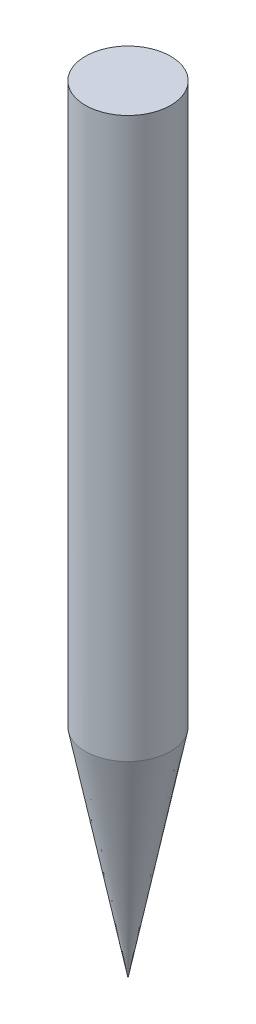
ISO-10303-21;
HEADER;
FILE_DESCRIPTION(('STEP AP214'),'2;1');
FILE_NAME('part.step','',(''),(''),'','','');
FILE_SCHEMA(('AUTOMOTIVE_DESIGN { 1 0 10303 214 1 1 1 1 }'));
ENDSEC;
DATA;
#1=APPLICATION_CONTEXT('core data for automotive mechanical design processes');
#2=APPLICATION_PROTOCOL_DEFINITION('international standard','automotive_design',2000,#1);
#3=PRODUCT_CONTEXT('',#1,'mechanical');
#4=PRODUCT('Part','Part','',(#3));
#5=PRODUCT_RELATED_PRODUCT_CATEGORY('part','',(#4));
#6=PRODUCT_DEFINITION_FORMATION('','',#4);
#7=PRODUCT_DEFINITION_CONTEXT('part definition',#1,'design');
#8=PRODUCT_DEFINITION('design','',#6,#7);
#9=PRODUCT_DEFINITION_SHAPE('','',#8);
#10=(LENGTH_UNIT() NAMED_UNIT(*) SI_UNIT(.MILLI.,.METRE.));
#11=(NAMED_UNIT(*) PLANE_ANGLE_UNIT() SI_UNIT($,.RADIAN.));
#12=(NAMED_UNIT(*) SI_UNIT($,.STERADIAN.) SOLID_ANGLE_UNIT());
#13=UNCERTAINTY_MEASURE_WITH_UNIT(LENGTH_MEASURE(1.E-05),#10,'distance_accuracy_value','');
#14=(GEOMETRIC_REPRESENTATION_CONTEXT(3) GLOBAL_UNCERTAINTY_ASSIGNED_CONTEXT((#13)) GLOBAL_UNIT_ASSIGNED_CONTEXT((#10,
#11,#12)) REPRESENTATION_CONTEXT('',''));
#15=CARTESIAN_POINT('',(0.,0.,0.));
#16=DIRECTION('',(0.,0.,1.));
#17=DIRECTION('',(1.,0.,0.));
#18=AXIS2_PLACEMENT_3D('',#15,#16,#17);
#19=CARTESIAN_POINT('',(0.,62.5,0.));
#20=DIRECTION('',(0.,-1.,0.));
#21=DIRECTION('',(1.,0.,0.));
#22=AXIS2_PLACEMENT_3D('',#19,#20,#21);
#23=PLANE('',#22);
#24=CARTESIAN_POINT('',(-2.18217583677695E-13,62.5,0.));
#25=DIRECTION('',(0.,-1.,0.));
#26=DIRECTION('',(1.,0.,0.));
#27=AXIS2_PLACEMENT_3D('',#24,#25,#26);
#28=CIRCLE('',#27,3.42500000000327);
#29=CARTESIAN_POINT('',(3.42500000000305,62.5,0.));
#30=VERTEX_POINT('',#29);
#31=EDGE_CURVE('E11',#30,#30,#28,.T.);
#32=ORIENTED_EDGE('',*,*,#31,.F.);
#33=EDGE_LOOP('',(#32));
#34=FACE_BOUND('',#33,.T.);
#35=ADVANCED_FACE('F31',(#34),#23,.F.);
#36=CARTESIAN_POINT('',(3.49148133884313E-12,-1000.,0.));
#37=DIRECTION('',(0.,-1.,0.));
#38=DIRECTION('',(1.,0.,0.));
#39=AXIS2_PLACEMENT_3D('',#36,#37,#38);
#40=CYLINDRICAL_SURFACE('',#39,3.42500000000335);
#41=CARTESIAN_POINT('',(0.,17.5000000000001,0.));
#42=DIRECTION('',(0.,-1.,0.));
#43=DIRECTION('',(1.,0.,0.));
#44=AXIS2_PLACEMENT_3D('',#41,#42,#43);
#45=CIRCLE('',#44,3.42500000000343);
#46=CARTESIAN_POINT('',(3.42500000000337,17.5000000000001,0.));
#47=VERTEX_POINT('',#46);
#48=EDGE_CURVE('E37',#47,#47,#45,.T.);
#49=ORIENTED_EDGE('',*,*,#48,.F.);
#50=EDGE_LOOP('',(#49));
#51=FACE_BOUND('',#50,.T.);
#52=ORIENTED_EDGE('',*,*,#31,.T.);
#53=EDGE_LOOP('',(#52));
#54=FACE_BOUND('',#53,.T.);
#55=ADVANCED_FACE('F43',(#51,#54),#40,.T.);
#56=CARTESIAN_POINT('',(0.,17.5000000000001,0.));
#57=DIRECTION('',(0.,1.,0.));
#58=DIRECTION('',(-1.,0.,0.));
#59=AXIS2_PLACEMENT_3D('',#56,#57,#58);
#60=CONICAL_SURFACE('',#59,3.42500000000343,0.19327130498273);
#61=CARTESIAN_POINT('',(0.,0.,0.));
#62=VERTEX_POINT('',#61);
#63=VERTEX_LOOP('',#62);
#64=FACE_BOUND('',#63,.T.);
#65=ORIENTED_EDGE('',*,*,#48,.T.);
#66=EDGE_LOOP('',(#65));
#67=FACE_BOUND('',#66,.T.);
#68=ADVANCED_FACE('F40',(#64,#67),#60,.T.);
#69=CLOSED_SHELL('',(#35,#55,#68));
#70=MANIFOLD_SOLID_BREP('B2',#69);
#71=ADVANCED_BREP_SHAPE_REPRESENTATION('',(#18,#70),#14);
#72=SHAPE_DEFINITION_REPRESENTATION(#9,#71);
ENDSEC;
END-ISO-10303-21;
